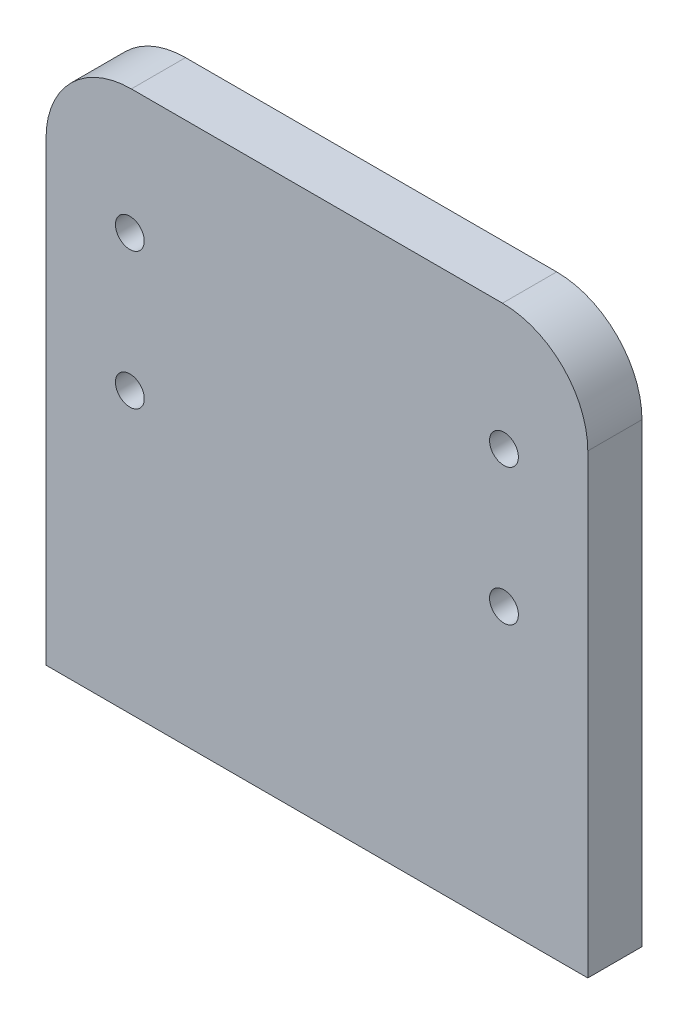
ISO-10303-21;
HEADER;
FILE_DESCRIPTION(('STEP AP214'),'2;1');
FILE_NAME('part.step','',(''),(''),'','','');
FILE_SCHEMA(('AUTOMOTIVE_DESIGN { 1 0 10303 214 1 1 1 1 }'));
ENDSEC;
DATA;
#1=APPLICATION_CONTEXT('core data for automotive mechanical design processes');
#2=APPLICATION_PROTOCOL_DEFINITION('international standard','automotive_design',2000,#1);
#3=PRODUCT_CONTEXT('',#1,'mechanical');
#4=PRODUCT('Part','Part','',(#3));
#5=PRODUCT_RELATED_PRODUCT_CATEGORY('part','',(#4));
#6=PRODUCT_DEFINITION_FORMATION('','',#4);
#7=PRODUCT_DEFINITION_CONTEXT('part definition',#1,'design');
#8=PRODUCT_DEFINITION('design','',#6,#7);
#9=PRODUCT_DEFINITION_SHAPE('','',#8);
#10=(LENGTH_UNIT() NAMED_UNIT(*) SI_UNIT(.MILLI.,.METRE.));
#11=(NAMED_UNIT(*) PLANE_ANGLE_UNIT() SI_UNIT($,.RADIAN.));
#12=(NAMED_UNIT(*) SI_UNIT($,.STERADIAN.) SOLID_ANGLE_UNIT());
#13=UNCERTAINTY_MEASURE_WITH_UNIT(LENGTH_MEASURE(1.E-05),#10,'distance_accuracy_value','');
#14=(GEOMETRIC_REPRESENTATION_CONTEXT(3) GLOBAL_UNCERTAINTY_ASSIGNED_CONTEXT((#13)) GLOBAL_UNIT_ASSIGNED_CONTEXT((#10,
#11,#12)) REPRESENTATION_CONTEXT('',''));
#15=CARTESIAN_POINT('',(0.,0.,0.));
#16=DIRECTION('',(0.,0.,1.));
#17=DIRECTION('',(1.,0.,0.));
#18=AXIS2_PLACEMENT_3D('',#15,#16,#17);
#19=CARTESIAN_POINT('',(-63.5,43.4999999999998,6.35));
#20=DIRECTION('',(1.,0.,0.));
#21=DIRECTION('',(0.,1.,0.));
#22=AXIS2_PLACEMENT_3D('',#19,#20,#21);
#23=PLANE('',#22);
#24=DIRECTION('',(0.,-1.,0.));
#25=VECTOR('',#24,1.);
#26=CARTESIAN_POINT('',(-63.5,43.4999999999998,-6.35));
#27=LINE('',#26,#25);
#28=CARTESIAN_POINT('',(-63.5,43.4999999999999,-6.35));
#29=VERTEX_POINT('',#28);
#30=CARTESIAN_POINT('',(-63.5,-63.5,-6.35));
#31=VERTEX_POINT('',#30);
#32=EDGE_CURVE('E116',#29,#31,#27,.T.);
#33=ORIENTED_EDGE('',*,*,#32,.T.);
#34=DIRECTION('',(0.,0.,-1.));
#35=VECTOR('',#34,1.);
#36=CARTESIAN_POINT('',(-63.5,-63.5,6.35));
#37=LINE('',#36,#35);
#38=CARTESIAN_POINT('',(-63.5,-63.5,6.35));
#39=VERTEX_POINT('',#38);
#40=EDGE_CURVE('E11',#39,#31,#37,.T.);
#41=ORIENTED_EDGE('',*,*,#40,.F.);
#42=DIRECTION('',(0.,-1.,0.));
#43=VECTOR('',#42,1.);
#44=CARTESIAN_POINT('',(-63.5,43.4999999999998,6.35));
#45=LINE('',#44,#43);
#46=CARTESIAN_POINT('',(-63.5,43.4999999999999,6.35));
#47=VERTEX_POINT('',#46);
#48=EDGE_CURVE('E127',#47,#39,#45,.T.);
#49=ORIENTED_EDGE('',*,*,#48,.F.);
#50=DIRECTION('',(0.,0.,-1.));
#51=VECTOR('',#50,1.);
#52=CARTESIAN_POINT('',(-63.5,43.4999999999999,6.35));
#53=LINE('',#52,#51);
#54=EDGE_CURVE('E112',#47,#29,#53,.T.);
#55=ORIENTED_EDGE('',*,*,#54,.T.);
#56=EDGE_LOOP('',(#33,#41,#49,#55));
#57=FACE_BOUND('',#56,.T.);
#58=ADVANCED_FACE('F32',(#57),#23,.F.);
#59=CARTESIAN_POINT('',(63.5,-63.5,6.35));
#60=DIRECTION('',(0.,1.,0.));
#61=DIRECTION('',(-1.,0.,0.));
#62=AXIS2_PLACEMENT_3D('',#59,#60,#61);
#63=PLANE('',#62);
#64=DIRECTION('',(1.,0.,0.));
#65=VECTOR('',#64,1.);
#66=CARTESIAN_POINT('',(63.5,-63.5,-6.35));
#67=LINE('',#66,#65);
#68=CARTESIAN_POINT('',(63.5,-63.5,-6.35));
#69=VERTEX_POINT('',#68);
#70=EDGE_CURVE('E119',#31,#69,#67,.T.);
#71=ORIENTED_EDGE('',*,*,#70,.T.);
#72=DIRECTION('',(0.,0.,-1.));
#73=VECTOR('',#72,1.);
#74=CARTESIAN_POINT('',(63.5,-63.5,6.35));
#75=LINE('',#74,#73);
#76=CARTESIAN_POINT('',(63.5,-63.5,6.35));
#77=VERTEX_POINT('',#76);
#78=EDGE_CURVE('E40',#77,#69,#75,.T.);
#79=ORIENTED_EDGE('',*,*,#78,.F.);
#80=DIRECTION('',(1.,0.,0.));
#81=VECTOR('',#80,1.);
#82=CARTESIAN_POINT('',(63.5,-63.5,6.35));
#83=LINE('',#82,#81);
#84=EDGE_CURVE('E85',#39,#77,#83,.T.);
#85=ORIENTED_EDGE('',*,*,#84,.F.);
#86=ORIENTED_EDGE('',*,*,#40,.T.);
#87=EDGE_LOOP('',(#71,#79,#85,#86));
#88=FACE_BOUND('',#87,.T.);
#89=ADVANCED_FACE('F152',(#88),#63,.F.);
#90=CARTESIAN_POINT('',(63.5,43.4999999999999,6.35));
#91=DIRECTION('',(-1.,0.,0.));
#92=DIRECTION('',(0.,-1.,0.));
#93=AXIS2_PLACEMENT_3D('',#90,#91,#92);
#94=PLANE('',#93);
#95=DIRECTION('',(0.,1.,0.));
#96=VECTOR('',#95,1.);
#97=CARTESIAN_POINT('',(63.5,43.4999999999999,-6.35));
#98=LINE('',#97,#96);
#99=CARTESIAN_POINT('',(63.5,43.4999999999999,-6.35));
#100=VERTEX_POINT('',#99);
#101=EDGE_CURVE('E122',#69,#100,#98,.T.);
#102=ORIENTED_EDGE('',*,*,#101,.T.);
#103=DIRECTION('',(0.,0.,-1.));
#104=VECTOR('',#103,1.);
#105=CARTESIAN_POINT('',(63.5,43.4999999999999,6.35));
#106=LINE('',#105,#104);
#107=CARTESIAN_POINT('',(63.5,43.4999999999999,6.35));
#108=VERTEX_POINT('',#107);
#109=EDGE_CURVE('E107',#108,#100,#106,.T.);
#110=ORIENTED_EDGE('',*,*,#109,.F.);
#111=DIRECTION('',(0.,1.,0.));
#112=VECTOR('',#111,1.);
#113=CARTESIAN_POINT('',(63.5,43.4999999999999,6.35));
#114=LINE('',#113,#112);
#115=EDGE_CURVE('E98',#77,#108,#114,.T.);
#116=ORIENTED_EDGE('',*,*,#115,.F.);
#117=ORIENTED_EDGE('',*,*,#78,.T.);
#118=EDGE_LOOP('',(#102,#110,#116,#117));
#119=FACE_BOUND('',#118,.T.);
#120=ADVANCED_FACE('F133',(#119),#94,.F.);
#121=CARTESIAN_POINT('',(43.5,43.5,6.35));
#122=DIRECTION('',(0.,0.,-1.));
#123=DIRECTION('',(-1.,0.,0.));
#124=AXIS2_PLACEMENT_3D('',#121,#122,#123);
#125=CYLINDRICAL_SURFACE('',#124,20.);
#126=CARTESIAN_POINT('',(43.5,43.5,-6.35));
#127=DIRECTION('',(0.,0.,1.));
#128=DIRECTION('',(-1.,0.,0.));
#129=AXIS2_PLACEMENT_3D('',#126,#127,#128);
#130=CIRCLE('',#129,20.);
#131=CARTESIAN_POINT('',(43.4999999999999,63.5,-6.35));
#132=VERTEX_POINT('',#131);
#133=EDGE_CURVE('E106',#100,#132,#130,.T.);
#134=ORIENTED_EDGE('',*,*,#133,.T.);
#135=DIRECTION('',(0.,0.,-1.));
#136=VECTOR('',#135,1.);
#137=CARTESIAN_POINT('',(43.4999999999999,63.5,6.35));
#138=LINE('',#137,#136);
#139=CARTESIAN_POINT('',(43.4999999999999,63.5,6.35));
#140=VERTEX_POINT('',#139);
#141=EDGE_CURVE('E103',#140,#132,#138,.T.);
#142=ORIENTED_EDGE('',*,*,#141,.F.);
#143=CARTESIAN_POINT('',(43.5,43.5,6.35));
#144=DIRECTION('',(0.,0.,1.));
#145=DIRECTION('',(-1.,0.,0.));
#146=AXIS2_PLACEMENT_3D('',#143,#144,#145);
#147=CIRCLE('',#146,20.);
#148=EDGE_CURVE('E92',#108,#140,#147,.T.);
#149=ORIENTED_EDGE('',*,*,#148,.F.);
#150=ORIENTED_EDGE('',*,*,#109,.T.);
#151=EDGE_LOOP('',(#134,#142,#149,#150));
#152=FACE_BOUND('',#151,.T.);
#153=ADVANCED_FACE('F104',(#152),#125,.T.);
#154=CARTESIAN_POINT('',(43.4999999999999,63.5,6.35));
#155=DIRECTION('',(0.,-1.,0.));
#156=DIRECTION('',(1.,0.,0.));
#157=AXIS2_PLACEMENT_3D('',#154,#155,#156);
#158=PLANE('',#157);
#159=DIRECTION('',(-1.,0.,0.));
#160=VECTOR('',#159,1.);
#161=CARTESIAN_POINT('',(43.4999999999999,63.5,-6.35));
#162=LINE('',#161,#160);
#163=CARTESIAN_POINT('',(-43.4999999999999,63.5,-6.35));
#164=VERTEX_POINT('',#163);
#165=EDGE_CURVE('E71',#132,#164,#162,.T.);
#166=ORIENTED_EDGE('',*,*,#165,.T.);
#167=DIRECTION('',(0.,0.,-1.));
#168=VECTOR('',#167,1.);
#169=CARTESIAN_POINT('',(-43.4999999999999,63.5,6.35));
#170=LINE('',#169,#168);
#171=CARTESIAN_POINT('',(-43.4999999999999,63.5,6.35));
#172=VERTEX_POINT('',#171);
#173=EDGE_CURVE('E108',#172,#164,#170,.T.);
#174=ORIENTED_EDGE('',*,*,#173,.F.);
#175=DIRECTION('',(-1.,0.,0.));
#176=VECTOR('',#175,1.);
#177=CARTESIAN_POINT('',(43.4999999999999,63.5,6.35));
#178=LINE('',#177,#176);
#179=EDGE_CURVE('E96',#140,#172,#178,.T.);
#180=ORIENTED_EDGE('',*,*,#179,.F.);
#181=ORIENTED_EDGE('',*,*,#141,.T.);
#182=EDGE_LOOP('',(#166,#174,#180,#181));
#183=FACE_BOUND('',#182,.T.);
#184=ADVANCED_FACE('F110',(#183),#158,.F.);
#185=CARTESIAN_POINT('',(-43.5,43.5,6.35));
#186=DIRECTION('',(0.,0.,-1.));
#187=DIRECTION('',(-1.,0.,0.));
#188=AXIS2_PLACEMENT_3D('',#185,#186,#187);
#189=CYLINDRICAL_SURFACE('',#188,20.);
#190=CARTESIAN_POINT('',(-43.5,43.5,-6.35));
#191=DIRECTION('',(0.,0.,1.));
#192=DIRECTION('',(1.,0.,0.));
#193=AXIS2_PLACEMENT_3D('',#190,#191,#192);
#194=CIRCLE('',#193,20.);
#195=EDGE_CURVE('E77',#164,#29,#194,.T.);
#196=ORIENTED_EDGE('',*,*,#195,.T.);
#197=ORIENTED_EDGE('',*,*,#54,.F.);
#198=CARTESIAN_POINT('',(-43.5,43.5,6.35));
#199=DIRECTION('',(0.,0.,1.));
#200=DIRECTION('',(1.,0.,0.));
#201=AXIS2_PLACEMENT_3D('',#198,#199,#200);
#202=CIRCLE('',#201,20.);
#203=EDGE_CURVE('E48',#172,#47,#202,.T.);
#204=ORIENTED_EDGE('',*,*,#203,.F.);
#205=ORIENTED_EDGE('',*,*,#173,.T.);
#206=EDGE_LOOP('',(#196,#197,#204,#205));
#207=FACE_BOUND('',#206,.T.);
#208=ADVANCED_FACE('F140',(#207),#189,.T.);
#209=CARTESIAN_POINT('',(43.5,43.5,6.35));
#210=DIRECTION('',(0.,0.,-1.));
#211=DIRECTION('',(-1.,0.,0.));
#212=AXIS2_PLACEMENT_3D('',#209,#210,#211);
#213=PLANE('',#212);
#214=CARTESIAN_POINT('',(-43.85,34.1000000000001,6.35));
#215=DIRECTION('',(0.,0.,-1.));
#216=DIRECTION('',(-1.,0.,0.));
#217=AXIS2_PLACEMENT_3D('',#214,#215,#216);
#218=CIRCLE('',#217,3.3782);
#219=CARTESIAN_POINT('',(-47.2282,34.1000000000001,6.35));
#220=VERTEX_POINT('',#219);
#221=EDGE_CURVE('E325',#220,#220,#218,.T.);
#222=ORIENTED_EDGE('',*,*,#221,.T.);
#223=EDGE_LOOP('',(#222));
#224=FACE_BOUND('',#223,.T.);
#225=CARTESIAN_POINT('',(-43.85,2.1000000000004,6.35));
#226=DIRECTION('',(0.,0.,-1.));
#227=DIRECTION('',(-1.,0.,0.));
#228=AXIS2_PLACEMENT_3D('',#225,#226,#227);
#229=CIRCLE('',#228,3.3782);
#230=CARTESIAN_POINT('',(-47.2282,2.1000000000004,6.35));
#231=VERTEX_POINT('',#230);
#232=EDGE_CURVE('E337',#231,#231,#229,.T.);
#233=ORIENTED_EDGE('',*,*,#232,.T.);
#234=EDGE_LOOP('',(#233));
#235=FACE_BOUND('',#234,.T.);
#236=CARTESIAN_POINT('',(43.85,2.1000000000004,6.35));
#237=DIRECTION('',(0.,0.,-1.));
#238=DIRECTION('',(-1.,0.,0.));
#239=AXIS2_PLACEMENT_3D('',#236,#237,#238);
#240=CIRCLE('',#239,3.3782);
#241=CARTESIAN_POINT('',(40.4718,2.1000000000004,6.35));
#242=VERTEX_POINT('',#241);
#243=EDGE_CURVE('E349',#242,#242,#240,.T.);
#244=ORIENTED_EDGE('',*,*,#243,.T.);
#245=EDGE_LOOP('',(#244));
#246=FACE_BOUND('',#245,.T.);
#247=CARTESIAN_POINT('',(43.85,34.1000000000001,6.35));
#248=DIRECTION('',(0.,0.,-1.));
#249=DIRECTION('',(-1.,0.,0.));
#250=AXIS2_PLACEMENT_3D('',#247,#248,#249);
#251=CIRCLE('',#250,3.3782);
#252=CARTESIAN_POINT('',(40.4718,34.1000000000001,6.35));
#253=VERTEX_POINT('',#252);
#254=EDGE_CURVE('E120',#253,#253,#251,.T.);
#255=ORIENTED_EDGE('',*,*,#254,.T.);
#256=EDGE_LOOP('',(#255));
#257=FACE_BOUND('',#256,.T.);
#258=ORIENTED_EDGE('',*,*,#48,.T.);
#259=ORIENTED_EDGE('',*,*,#84,.T.);
#260=ORIENTED_EDGE('',*,*,#115,.T.);
#261=ORIENTED_EDGE('',*,*,#148,.T.);
#262=ORIENTED_EDGE('',*,*,#179,.T.);
#263=ORIENTED_EDGE('',*,*,#203,.T.);
#264=EDGE_LOOP('',(#258,#259,#260,#261,#262,#263));
#265=FACE_BOUND('',#264,.T.);
#266=ADVANCED_FACE('F94',(#224,#235,#246,#257,#265),#213,.F.);
#267=CARTESIAN_POINT('',(43.5,43.5,-6.35));
#268=DIRECTION('',(0.,0.,-1.));
#269=DIRECTION('',(-1.,0.,0.));
#270=AXIS2_PLACEMENT_3D('',#267,#268,#269);
#271=PLANE('',#270);
#272=CARTESIAN_POINT('',(-43.85,34.1000000000001,-6.35));
#273=DIRECTION('',(0.,0.,-1.));
#274=DIRECTION('',(-1.,0.,0.));
#275=AXIS2_PLACEMENT_3D('',#272,#273,#274);
#276=CIRCLE('',#275,5.55625);
#277=CARTESIAN_POINT('',(-49.40625,34.1000000000001,-6.35));
#278=VERTEX_POINT('',#277);
#279=EDGE_CURVE('E318',#278,#278,#276,.T.);
#280=ORIENTED_EDGE('',*,*,#279,.F.);
#281=EDGE_LOOP('',(#280));
#282=FACE_BOUND('',#281,.T.);
#283=CARTESIAN_POINT('',(-43.85,2.1000000000004,-6.35));
#284=DIRECTION('',(0.,0.,-1.));
#285=DIRECTION('',(-1.,0.,0.));
#286=AXIS2_PLACEMENT_3D('',#283,#284,#285);
#287=CIRCLE('',#286,5.55625);
#288=CARTESIAN_POINT('',(-49.40625,2.1000000000004,-6.35));
#289=VERTEX_POINT('',#288);
#290=EDGE_CURVE('E328',#289,#289,#287,.T.);
#291=ORIENTED_EDGE('',*,*,#290,.F.);
#292=EDGE_LOOP('',(#291));
#293=FACE_BOUND('',#292,.T.);
#294=CARTESIAN_POINT('',(43.85,2.1000000000004,-6.35));
#295=DIRECTION('',(0.,0.,-1.));
#296=DIRECTION('',(-1.,0.,0.));
#297=AXIS2_PLACEMENT_3D('',#294,#295,#296);
#298=CIRCLE('',#297,5.55625);
#299=CARTESIAN_POINT('',(38.29375,2.1000000000004,-6.35));
#300=VERTEX_POINT('',#299);
#301=EDGE_CURVE('E340',#300,#300,#298,.T.);
#302=ORIENTED_EDGE('',*,*,#301,.F.);
#303=EDGE_LOOP('',(#302));
#304=FACE_BOUND('',#303,.T.);
#305=CARTESIAN_POINT('',(43.85,34.1000000000001,-6.35));
#306=DIRECTION('',(0.,0.,-1.));
#307=DIRECTION('',(-1.,0.,0.));
#308=AXIS2_PLACEMENT_3D('',#305,#306,#307);
#309=CIRCLE('',#308,5.55625);
#310=CARTESIAN_POINT('',(38.29375,34.1000000000001,-6.35));
#311=VERTEX_POINT('',#310);
#312=EDGE_CURVE('E352',#311,#311,#309,.T.);
#313=ORIENTED_EDGE('',*,*,#312,.F.);
#314=EDGE_LOOP('',(#313));
#315=FACE_BOUND('',#314,.T.);
#316=ORIENTED_EDGE('',*,*,#32,.F.);
#317=ORIENTED_EDGE('',*,*,#195,.F.);
#318=ORIENTED_EDGE('',*,*,#165,.F.);
#319=ORIENTED_EDGE('',*,*,#133,.F.);
#320=ORIENTED_EDGE('',*,*,#101,.F.);
#321=ORIENTED_EDGE('',*,*,#70,.F.);
#322=EDGE_LOOP('',(#316,#317,#318,#319,#320,#321));
#323=FACE_BOUND('',#322,.T.);
#324=ADVANCED_FACE('F136',(#282,#293,#304,#315,#323),#271,.T.);
#325=CARTESIAN_POINT('',(43.85,34.1000000000001,-6.35));
#326=DIRECTION('',(0.,0.,-1.));
#327=DIRECTION('',(-1.,0.,0.));
#328=AXIS2_PLACEMENT_3D('',#325,#326,#327);
#329=CYLINDRICAL_SURFACE('',#328,3.3782);
#330=ORIENTED_EDGE('',*,*,#254,.F.);
#331=EDGE_LOOP('',(#330));
#332=FACE_BOUND('',#331,.T.);
#333=CARTESIAN_POINT('',(43.85,34.1000000000001,0.));
#334=DIRECTION('',(0.,0.,-1.));
#335=DIRECTION('',(-1.,0.,0.));
#336=AXIS2_PLACEMENT_3D('',#333,#334,#335);
#337=CIRCLE('',#336,3.37820000000001);
#338=CARTESIAN_POINT('',(40.4717999999999,34.1000000000001,0.));
#339=VERTEX_POINT('',#338);
#340=EDGE_CURVE('E358',#339,#339,#337,.T.);
#341=ORIENTED_EDGE('',*,*,#340,.T.);
#342=EDGE_LOOP('',(#341));
#343=FACE_BOUND('',#342,.T.);
#344=ADVANCED_FACE('F189',(#332,#343),#329,.F.);
#345=CARTESIAN_POINT('',(47.2282,34.1000000000001,0.));
#346=DIRECTION('',(0.,0.,1.));
#347=DIRECTION('',(1.,0.,0.));
#348=AXIS2_PLACEMENT_3D('',#345,#346,#347);
#349=PLANE('',#348);
#350=ORIENTED_EDGE('',*,*,#340,.F.);
#351=EDGE_LOOP('',(#350));
#352=FACE_BOUND('',#351,.T.);
#353=CARTESIAN_POINT('',(43.85,34.1000000000001,0.));
#354=DIRECTION('',(0.,0.,-1.));
#355=DIRECTION('',(-1.,0.,0.));
#356=AXIS2_PLACEMENT_3D('',#353,#354,#355);
#357=CIRCLE('',#356,5.55625);
#358=CARTESIAN_POINT('',(38.29375,34.1000000000001,0.));
#359=VERTEX_POINT('',#358);
#360=EDGE_CURVE('E355',#359,#359,#357,.T.);
#361=ORIENTED_EDGE('',*,*,#360,.T.);
#362=EDGE_LOOP('',(#361));
#363=FACE_BOUND('',#362,.T.);
#364=ADVANCED_FACE('F198',(#352,#363),#349,.F.);
#365=CARTESIAN_POINT('',(43.85,34.1000000000001,-6.35));
#366=DIRECTION('',(0.,0.,-1.));
#367=DIRECTION('',(-1.,0.,0.));
#368=AXIS2_PLACEMENT_3D('',#365,#366,#367);
#369=CYLINDRICAL_SURFACE('',#368,5.55625);
#370=ORIENTED_EDGE('',*,*,#360,.F.);
#371=EDGE_LOOP('',(#370));
#372=FACE_BOUND('',#371,.T.);
#373=ORIENTED_EDGE('',*,*,#312,.T.);
#374=EDGE_LOOP('',(#373));
#375=FACE_BOUND('',#374,.T.);
#376=ADVANCED_FACE('F208',(#372,#375),#369,.F.);
#377=CARTESIAN_POINT('',(43.85,2.1000000000004,-6.35));
#378=DIRECTION('',(0.,0.,-1.));
#379=DIRECTION('',(-1.,0.,0.));
#380=AXIS2_PLACEMENT_3D('',#377,#378,#379);
#381=CYLINDRICAL_SURFACE('',#380,3.3782);
#382=ORIENTED_EDGE('',*,*,#243,.F.);
#383=EDGE_LOOP('',(#382));
#384=FACE_BOUND('',#383,.T.);
#385=CARTESIAN_POINT('',(43.85,2.1000000000004,0.));
#386=DIRECTION('',(0.,0.,-1.));
#387=DIRECTION('',(-1.,0.,0.));
#388=AXIS2_PLACEMENT_3D('',#385,#386,#387);
#389=CIRCLE('',#388,3.37820000000001);
#390=CARTESIAN_POINT('',(40.4717999999999,2.1000000000004,0.));
#391=VERTEX_POINT('',#390);
#392=EDGE_CURVE('E346',#391,#391,#389,.T.);
#393=ORIENTED_EDGE('',*,*,#392,.T.);
#394=EDGE_LOOP('',(#393));
#395=FACE_BOUND('',#394,.T.);
#396=ADVANCED_FACE('F218',(#384,#395),#381,.F.);
#397=CARTESIAN_POINT('',(47.2282,2.1000000000004,0.));
#398=DIRECTION('',(0.,0.,1.));
#399=DIRECTION('',(1.,0.,0.));
#400=AXIS2_PLACEMENT_3D('',#397,#398,#399);
#401=PLANE('',#400);
#402=ORIENTED_EDGE('',*,*,#392,.F.);
#403=EDGE_LOOP('',(#402));
#404=FACE_BOUND('',#403,.T.);
#405=CARTESIAN_POINT('',(43.85,2.1000000000004,0.));
#406=DIRECTION('',(0.,0.,-1.));
#407=DIRECTION('',(-1.,0.,0.));
#408=AXIS2_PLACEMENT_3D('',#405,#406,#407);
#409=CIRCLE('',#408,5.55625);
#410=CARTESIAN_POINT('',(38.29375,2.1000000000004,0.));
#411=VERTEX_POINT('',#410);
#412=EDGE_CURVE('E343',#411,#411,#409,.T.);
#413=ORIENTED_EDGE('',*,*,#412,.T.);
#414=EDGE_LOOP('',(#413));
#415=FACE_BOUND('',#414,.T.);
#416=ADVANCED_FACE('F228',(#404,#415),#401,.F.);
#417=CARTESIAN_POINT('',(43.85,2.1000000000004,-6.35));
#418=DIRECTION('',(0.,0.,-1.));
#419=DIRECTION('',(-1.,0.,0.));
#420=AXIS2_PLACEMENT_3D('',#417,#418,#419);
#421=CYLINDRICAL_SURFACE('',#420,5.55625);
#422=ORIENTED_EDGE('',*,*,#412,.F.);
#423=EDGE_LOOP('',(#422));
#424=FACE_BOUND('',#423,.T.);
#425=ORIENTED_EDGE('',*,*,#301,.T.);
#426=EDGE_LOOP('',(#425));
#427=FACE_BOUND('',#426,.T.);
#428=ADVANCED_FACE('F238',(#424,#427),#421,.F.);
#429=CARTESIAN_POINT('',(-43.85,2.1000000000004,-6.35));
#430=DIRECTION('',(0.,0.,-1.));
#431=DIRECTION('',(-1.,0.,0.));
#432=AXIS2_PLACEMENT_3D('',#429,#430,#431);
#433=CYLINDRICAL_SURFACE('',#432,3.3782);
#434=ORIENTED_EDGE('',*,*,#232,.F.);
#435=EDGE_LOOP('',(#434));
#436=FACE_BOUND('',#435,.T.);
#437=CARTESIAN_POINT('',(-43.85,2.1000000000004,0.));
#438=DIRECTION('',(0.,0.,-1.));
#439=DIRECTION('',(-1.,0.,0.));
#440=AXIS2_PLACEMENT_3D('',#437,#438,#439);
#441=CIRCLE('',#440,3.37820000000001);
#442=CARTESIAN_POINT('',(-47.2282,2.1000000000004,0.));
#443=VERTEX_POINT('',#442);
#444=EDGE_CURVE('E334',#443,#443,#441,.T.);
#445=ORIENTED_EDGE('',*,*,#444,.T.);
#446=EDGE_LOOP('',(#445));
#447=FACE_BOUND('',#446,.T.);
#448=ADVANCED_FACE('F248',(#436,#447),#433,.F.);
#449=CARTESIAN_POINT('',(-40.4717999999999,2.1000000000004,0.));
#450=DIRECTION('',(0.,0.,1.));
#451=DIRECTION('',(1.,0.,0.));
#452=AXIS2_PLACEMENT_3D('',#449,#450,#451);
#453=PLANE('',#452);
#454=ORIENTED_EDGE('',*,*,#444,.F.);
#455=EDGE_LOOP('',(#454));
#456=FACE_BOUND('',#455,.T.);
#457=CARTESIAN_POINT('',(-43.85,2.1000000000004,0.));
#458=DIRECTION('',(0.,0.,-1.));
#459=DIRECTION('',(-1.,0.,0.));
#460=AXIS2_PLACEMENT_3D('',#457,#458,#459);
#461=CIRCLE('',#460,5.55625);
#462=CARTESIAN_POINT('',(-49.40625,2.1000000000004,0.));
#463=VERTEX_POINT('',#462);
#464=EDGE_CURVE('E331',#463,#463,#461,.T.);
#465=ORIENTED_EDGE('',*,*,#464,.T.);
#466=EDGE_LOOP('',(#465));
#467=FACE_BOUND('',#466,.T.);
#468=ADVANCED_FACE('F258',(#456,#467),#453,.F.);
#469=CARTESIAN_POINT('',(-43.85,2.1000000000004,-6.35));
#470=DIRECTION('',(0.,0.,-1.));
#471=DIRECTION('',(-1.,0.,0.));
#472=AXIS2_PLACEMENT_3D('',#469,#470,#471);
#473=CYLINDRICAL_SURFACE('',#472,5.55625);
#474=ORIENTED_EDGE('',*,*,#464,.F.);
#475=EDGE_LOOP('',(#474));
#476=FACE_BOUND('',#475,.T.);
#477=ORIENTED_EDGE('',*,*,#290,.T.);
#478=EDGE_LOOP('',(#477));
#479=FACE_BOUND('',#478,.T.);
#480=ADVANCED_FACE('F268',(#476,#479),#473,.F.);
#481=CARTESIAN_POINT('',(-43.85,34.1000000000001,-6.35));
#482=DIRECTION('',(0.,0.,-1.));
#483=DIRECTION('',(-1.,0.,0.));
#484=AXIS2_PLACEMENT_3D('',#481,#482,#483);
#485=CYLINDRICAL_SURFACE('',#484,3.3782);
#486=ORIENTED_EDGE('',*,*,#221,.F.);
#487=EDGE_LOOP('',(#486));
#488=FACE_BOUND('',#487,.T.);
#489=CARTESIAN_POINT('',(-43.85,34.1000000000001,0.));
#490=DIRECTION('',(0.,0.,-1.));
#491=DIRECTION('',(-1.,0.,0.));
#492=AXIS2_PLACEMENT_3D('',#489,#490,#491);
#493=CIRCLE('',#492,3.37820000000001);
#494=CARTESIAN_POINT('',(-47.2282,34.1000000000001,0.));
#495=VERTEX_POINT('',#494);
#496=EDGE_CURVE('E320',#495,#495,#493,.T.);
#497=ORIENTED_EDGE('',*,*,#496,.T.);
#498=EDGE_LOOP('',(#497));
#499=FACE_BOUND('',#498,.T.);
#500=ADVANCED_FACE('F278',(#488,#499),#485,.F.);
#501=CARTESIAN_POINT('',(-40.4717999999999,34.1000000000001,0.));
#502=DIRECTION('',(0.,0.,1.));
#503=DIRECTION('',(1.,0.,0.));
#504=AXIS2_PLACEMENT_3D('',#501,#502,#503);
#505=PLANE('',#504);
#506=ORIENTED_EDGE('',*,*,#496,.F.);
#507=EDGE_LOOP('',(#506));
#508=FACE_BOUND('',#507,.T.);
#509=CARTESIAN_POINT('',(-43.85,34.1000000000001,0.));
#510=DIRECTION('',(0.,0.,-1.));
#511=DIRECTION('',(-1.,0.,0.));
#512=AXIS2_PLACEMENT_3D('',#509,#510,#511);
#513=CIRCLE('',#512,5.55625);
#514=CARTESIAN_POINT('',(-49.40625,34.1000000000001,0.));
#515=VERTEX_POINT('',#514);
#516=EDGE_CURVE('E315',#515,#515,#513,.T.);
#517=ORIENTED_EDGE('',*,*,#516,.T.);
#518=EDGE_LOOP('',(#517));
#519=FACE_BOUND('',#518,.T.);
#520=ADVANCED_FACE('F288',(#508,#519),#505,.F.);
#521=CARTESIAN_POINT('',(-43.85,34.1000000000001,-6.35));
#522=DIRECTION('',(0.,0.,-1.));
#523=DIRECTION('',(-1.,0.,0.));
#524=AXIS2_PLACEMENT_3D('',#521,#522,#523);
#525=CYLINDRICAL_SURFACE('',#524,5.55625);
#526=ORIENTED_EDGE('',*,*,#516,.F.);
#527=EDGE_LOOP('',(#526));
#528=FACE_BOUND('',#527,.T.);
#529=ORIENTED_EDGE('',*,*,#279,.T.);
#530=EDGE_LOOP('',(#529));
#531=FACE_BOUND('',#530,.T.);
#532=ADVANCED_FACE('F298',(#528,#531),#525,.F.);
#533=CLOSED_SHELL('',(#58,#89,#120,#153,#184,#208,#266,#324,#344,#364,#376,#396,#416,#428,#448,
#468,#480,#500,#520,#532));
#534=MANIFOLD_SOLID_BREP('B2',#533);
#535=ADVANCED_BREP_SHAPE_REPRESENTATION('',(#18,#534),#14);
#536=SHAPE_DEFINITION_REPRESENTATION(#9,#535);
ENDSEC;
END-ISO-10303-21;
